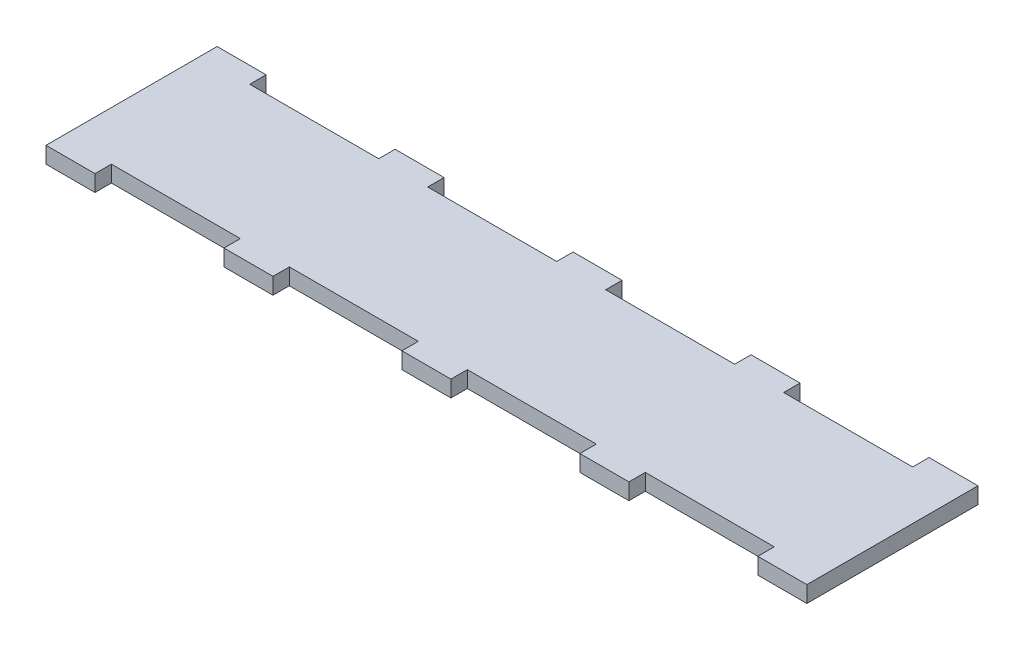
ISO-10303-21;
HEADER;
FILE_DESCRIPTION(('STEP AP214'),'2;1');
FILE_NAME('part.step','',(''),(''),'','','');
FILE_SCHEMA(('AUTOMOTIVE_DESIGN { 1 0 10303 214 1 1 1 1 }'));
ENDSEC;
DATA;
#1=APPLICATION_CONTEXT('core data for automotive mechanical design processes');
#2=APPLICATION_PROTOCOL_DEFINITION('international standard','automotive_design',2000,#1);
#3=PRODUCT_CONTEXT('',#1,'mechanical');
#4=PRODUCT('Part','Part','',(#3));
#5=PRODUCT_RELATED_PRODUCT_CATEGORY('part','',(#4));
#6=PRODUCT_DEFINITION_FORMATION('','',#4);
#7=PRODUCT_DEFINITION_CONTEXT('part definition',#1,'design');
#8=PRODUCT_DEFINITION('design','',#6,#7);
#9=PRODUCT_DEFINITION_SHAPE('','',#8);
#10=(LENGTH_UNIT() NAMED_UNIT(*) SI_UNIT(.MILLI.,.METRE.));
#11=(NAMED_UNIT(*) PLANE_ANGLE_UNIT() SI_UNIT($,.RADIAN.));
#12=(NAMED_UNIT(*) SI_UNIT($,.STERADIAN.) SOLID_ANGLE_UNIT());
#13=UNCERTAINTY_MEASURE_WITH_UNIT(LENGTH_MEASURE(1.E-05),#10,'distance_accuracy_value','');
#14=(GEOMETRIC_REPRESENTATION_CONTEXT(3) GLOBAL_UNCERTAINTY_ASSIGNED_CONTEXT((#13)) GLOBAL_UNIT_ASSIGNED_CONTEXT((#10,
#11,#12)) REPRESENTATION_CONTEXT('',''));
#15=CARTESIAN_POINT('',(0.,0.,0.));
#16=DIRECTION('',(0.,0.,1.));
#17=DIRECTION('',(1.,0.,0.));
#18=AXIS2_PLACEMENT_3D('',#15,#16,#17);
#19=CARTESIAN_POINT('',(0.,6.35,53.65));
#20=DIRECTION('',(1.,0.,0.));
#21=DIRECTION('',(0.,0.,-1.));
#22=AXIS2_PLACEMENT_3D('',#19,#20,#21);
#23=PLANE('',#22);
#24=DIRECTION('',(0.,0.,1.));
#25=VECTOR('',#24,1.);
#26=CARTESIAN_POINT('',(0.,0.,53.65));
#27=LINE('',#26,#25);
#28=CARTESIAN_POINT('',(0.,0.,-6.35));
#29=VERTEX_POINT('',#28);
#30=CARTESIAN_POINT('',(0.,0.,60.));
#31=VERTEX_POINT('',#30);
#32=EDGE_CURVE('E169',#29,#31,#27,.T.);
#33=ORIENTED_EDGE('',*,*,#32,.T.);
#34=DIRECTION('',(0.,-1.,0.));
#35=VECTOR('',#34,1.);
#36=CARTESIAN_POINT('',(0.,6.35,60.));
#37=LINE('',#36,#35);
#38=CARTESIAN_POINT('',(0.,6.35,60.));
#39=VERTEX_POINT('',#38);
#40=EDGE_CURVE('E11',#39,#31,#37,.T.);
#41=ORIENTED_EDGE('',*,*,#40,.F.);
#42=DIRECTION('',(0.,0.,1.));
#43=VECTOR('',#42,1.);
#44=CARTESIAN_POINT('',(0.,6.35,0.));
#45=LINE('',#44,#43);
#46=CARTESIAN_POINT('',(0.,6.35,-6.35));
#47=VERTEX_POINT('',#46);
#48=EDGE_CURVE('E175',#47,#39,#45,.T.);
#49=ORIENTED_EDGE('',*,*,#48,.F.);
#50=DIRECTION('',(0.,-1.,0.));
#51=VECTOR('',#50,1.);
#52=CARTESIAN_POINT('',(0.,6.35,-6.35));
#53=LINE('',#52,#51);
#54=EDGE_CURVE('E293',#47,#29,#53,.T.);
#55=ORIENTED_EDGE('',*,*,#54,.T.);
#56=EDGE_LOOP('',(#33,#41,#49,#55));
#57=FACE_BOUND('',#56,.T.);
#58=ADVANCED_FACE('F33',(#57),#23,.F.);
#59=CARTESIAN_POINT('',(0.,6.35,60.));
#60=DIRECTION('',(0.,0.,-1.));
#61=DIRECTION('',(-1.,0.,0.));
#62=AXIS2_PLACEMENT_3D('',#59,#60,#61);
#63=PLANE('',#62);
#64=DIRECTION('',(1.,0.,0.));
#65=VECTOR('',#64,1.);
#66=CARTESIAN_POINT('',(0.,0.,60.));
#67=LINE('',#66,#65);
#68=CARTESIAN_POINT('',(19.,0.,60.));
#69=VERTEX_POINT('',#68);
#70=EDGE_CURVE('E298',#31,#69,#67,.T.);
#71=ORIENTED_EDGE('',*,*,#70,.T.);
#72=DIRECTION('',(0.,-1.,0.));
#73=VECTOR('',#72,1.);
#74=CARTESIAN_POINT('',(19.,6.35,60.));
#75=LINE('',#74,#73);
#76=CARTESIAN_POINT('',(19.,6.35,60.));
#77=VERTEX_POINT('',#76);
#78=EDGE_CURVE('E41',#77,#69,#75,.T.);
#79=ORIENTED_EDGE('',*,*,#78,.F.);
#80=DIRECTION('',(1.,0.,0.));
#81=VECTOR('',#80,1.);
#82=CARTESIAN_POINT('',(0.,6.35,60.));
#83=LINE('',#82,#81);
#84=EDGE_CURVE('E555',#39,#77,#83,.T.);
#85=ORIENTED_EDGE('',*,*,#84,.F.);
#86=ORIENTED_EDGE('',*,*,#40,.T.);
#87=EDGE_LOOP('',(#71,#79,#85,#86));
#88=FACE_BOUND('',#87,.T.);
#89=ADVANCED_FACE('F558',(#88),#63,.F.);
#90=CARTESIAN_POINT('',(19.,6.35,53.65));
#91=DIRECTION('',(-1.,0.,0.));
#92=DIRECTION('',(0.,0.,1.));
#93=AXIS2_PLACEMENT_3D('',#90,#91,#92);
#94=PLANE('',#93);
#95=DIRECTION('',(0.,0.,-1.));
#96=VECTOR('',#95,1.);
#97=CARTESIAN_POINT('',(19.,0.,53.65));
#98=LINE('',#97,#96);
#99=CARTESIAN_POINT('',(19.,0.,53.65));
#100=VERTEX_POINT('',#99);
#101=EDGE_CURVE('E300',#69,#100,#98,.T.);
#102=ORIENTED_EDGE('',*,*,#101,.T.);
#103=DIRECTION('',(0.,-1.,0.));
#104=VECTOR('',#103,1.);
#105=CARTESIAN_POINT('',(19.,6.35,53.65));
#106=LINE('',#105,#104);
#107=CARTESIAN_POINT('',(19.,6.35,53.65));
#108=VERTEX_POINT('',#107);
#109=EDGE_CURVE('E458',#108,#100,#106,.T.);
#110=ORIENTED_EDGE('',*,*,#109,.F.);
#111=DIRECTION('',(0.,0.,-1.));
#112=VECTOR('',#111,1.);
#113=CARTESIAN_POINT('',(19.,6.35,53.65));
#114=LINE('',#113,#112);
#115=EDGE_CURVE('E467',#77,#108,#114,.T.);
#116=ORIENTED_EDGE('',*,*,#115,.F.);
#117=ORIENTED_EDGE('',*,*,#78,.T.);
#118=EDGE_LOOP('',(#102,#110,#116,#117));
#119=FACE_BOUND('',#118,.T.);
#120=ADVANCED_FACE('F465',(#119),#94,.F.);
#121=CARTESIAN_POINT('',(19.,6.35,53.65));
#122=DIRECTION('',(0.,0.,-1.));
#123=DIRECTION('',(-1.,0.,0.));
#124=AXIS2_PLACEMENT_3D('',#121,#122,#123);
#125=PLANE('',#124);
#126=DIRECTION('',(1.,0.,0.));
#127=VECTOR('',#126,1.);
#128=CARTESIAN_POINT('',(19.,0.,53.65));
#129=LINE('',#128,#127);
#130=CARTESIAN_POINT('',(69.,0.,53.65));
#131=VERTEX_POINT('',#130);
#132=EDGE_CURVE('E302',#100,#131,#129,.T.);
#133=ORIENTED_EDGE('',*,*,#132,.T.);
#134=DIRECTION('',(0.,-1.,0.));
#135=VECTOR('',#134,1.);
#136=CARTESIAN_POINT('',(69.,6.35,53.65));
#137=LINE('',#136,#135);
#138=CARTESIAN_POINT('',(69.,6.35,53.65));
#139=VERTEX_POINT('',#138);
#140=EDGE_CURVE('E455',#139,#131,#137,.T.);
#141=ORIENTED_EDGE('',*,*,#140,.F.);
#142=DIRECTION('',(1.,0.,0.));
#143=VECTOR('',#142,1.);
#144=CARTESIAN_POINT('',(19.,6.35,53.65));
#145=LINE('',#144,#143);
#146=EDGE_CURVE('E485',#108,#139,#145,.T.);
#147=ORIENTED_EDGE('',*,*,#146,.F.);
#148=ORIENTED_EDGE('',*,*,#109,.T.);
#149=EDGE_LOOP('',(#133,#141,#147,#148));
#150=FACE_BOUND('',#149,.T.);
#151=ADVANCED_FACE('F476',(#150),#125,.F.);
#152=CARTESIAN_POINT('',(69.,6.35,53.65));
#153=DIRECTION('',(1.,0.,0.));
#154=DIRECTION('',(0.,0.,-1.));
#155=AXIS2_PLACEMENT_3D('',#152,#153,#154);
#156=PLANE('',#155);
#157=DIRECTION('',(0.,0.,1.));
#158=VECTOR('',#157,1.);
#159=CARTESIAN_POINT('',(69.,0.,53.65));
#160=LINE('',#159,#158);
#161=CARTESIAN_POINT('',(69.,0.,60.));
#162=VERTEX_POINT('',#161);
#163=EDGE_CURVE('E304',#131,#162,#160,.T.);
#164=ORIENTED_EDGE('',*,*,#163,.T.);
#165=DIRECTION('',(0.,-1.,0.));
#166=VECTOR('',#165,1.);
#167=CARTESIAN_POINT('',(69.,6.35,60.));
#168=LINE('',#167,#166);
#169=CARTESIAN_POINT('',(69.,6.35,60.));
#170=VERTEX_POINT('',#169);
#171=EDGE_CURVE('E452',#170,#162,#168,.T.);
#172=ORIENTED_EDGE('',*,*,#171,.F.);
#173=DIRECTION('',(0.,0.,1.));
#174=VECTOR('',#173,1.);
#175=CARTESIAN_POINT('',(69.,6.35,53.65));
#176=LINE('',#175,#174);
#177=EDGE_CURVE('E482',#139,#170,#176,.T.);
#178=ORIENTED_EDGE('',*,*,#177,.F.);
#179=ORIENTED_EDGE('',*,*,#140,.T.);
#180=EDGE_LOOP('',(#164,#172,#178,#179));
#181=FACE_BOUND('',#180,.T.);
#182=ADVANCED_FACE('F480',(#181),#156,.F.);
#183=CARTESIAN_POINT('',(69.,6.35,60.));
#184=DIRECTION('',(0.,0.,-1.));
#185=DIRECTION('',(-1.,0.,0.));
#186=AXIS2_PLACEMENT_3D('',#183,#184,#185);
#187=PLANE('',#186);
#188=DIRECTION('',(1.,0.,0.));
#189=VECTOR('',#188,1.);
#190=CARTESIAN_POINT('',(69.,0.,60.));
#191=LINE('',#190,#189);
#192=CARTESIAN_POINT('',(88.,0.,60.));
#193=VERTEX_POINT('',#192);
#194=EDGE_CURVE('E306',#162,#193,#191,.T.);
#195=ORIENTED_EDGE('',*,*,#194,.T.);
#196=DIRECTION('',(0.,-1.,0.));
#197=VECTOR('',#196,1.);
#198=CARTESIAN_POINT('',(88.,6.35,60.));
#199=LINE('',#198,#197);
#200=CARTESIAN_POINT('',(88.,6.35,60.));
#201=VERTEX_POINT('',#200);
#202=EDGE_CURVE('E449',#201,#193,#199,.T.);
#203=ORIENTED_EDGE('',*,*,#202,.F.);
#204=DIRECTION('',(1.,0.,0.));
#205=VECTOR('',#204,1.);
#206=CARTESIAN_POINT('',(69.,6.35,60.));
#207=LINE('',#206,#205);
#208=EDGE_CURVE('E484',#170,#201,#207,.T.);
#209=ORIENTED_EDGE('',*,*,#208,.F.);
#210=ORIENTED_EDGE('',*,*,#171,.T.);
#211=EDGE_LOOP('',(#195,#203,#209,#210));
#212=FACE_BOUND('',#211,.T.);
#213=ADVANCED_FACE('F570',(#212),#187,.F.);
#214=CARTESIAN_POINT('',(88.,6.35,53.65));
#215=DIRECTION('',(-1.,0.,0.));
#216=DIRECTION('',(0.,0.,1.));
#217=AXIS2_PLACEMENT_3D('',#214,#215,#216);
#218=PLANE('',#217);
#219=DIRECTION('',(0.,0.,-1.));
#220=VECTOR('',#219,1.);
#221=CARTESIAN_POINT('',(88.,0.,53.65));
#222=LINE('',#221,#220);
#223=CARTESIAN_POINT('',(88.,0.,53.65));
#224=VERTEX_POINT('',#223);
#225=EDGE_CURVE('E308',#193,#224,#222,.T.);
#226=ORIENTED_EDGE('',*,*,#225,.T.);
#227=DIRECTION('',(0.,-1.,0.));
#228=VECTOR('',#227,1.);
#229=CARTESIAN_POINT('',(88.,6.35,53.65));
#230=LINE('',#229,#228);
#231=CARTESIAN_POINT('',(88.,6.35,53.65));
#232=VERTEX_POINT('',#231);
#233=EDGE_CURVE('E446',#232,#224,#230,.T.);
#234=ORIENTED_EDGE('',*,*,#233,.F.);
#235=DIRECTION('',(0.,0.,-1.));
#236=VECTOR('',#235,1.);
#237=CARTESIAN_POINT('',(88.,6.35,53.65));
#238=LINE('',#237,#236);
#239=EDGE_CURVE('E487',#201,#232,#238,.T.);
#240=ORIENTED_EDGE('',*,*,#239,.F.);
#241=ORIENTED_EDGE('',*,*,#202,.T.);
#242=EDGE_LOOP('',(#226,#234,#240,#241));
#243=FACE_BOUND('',#242,.T.);
#244=ADVANCED_FACE('F573',(#243),#218,.F.);
#245=CARTESIAN_POINT('',(88.,6.35,53.65));
#246=DIRECTION('',(0.,0.,-1.));
#247=DIRECTION('',(-1.,0.,0.));
#248=AXIS2_PLACEMENT_3D('',#245,#246,#247);
#249=PLANE('',#248);
#250=DIRECTION('',(1.,0.,0.));
#251=VECTOR('',#250,1.);
#252=CARTESIAN_POINT('',(88.,0.,53.65));
#253=LINE('',#252,#251);
#254=CARTESIAN_POINT('',(138.,0.,53.65));
#255=VERTEX_POINT('',#254);
#256=EDGE_CURVE('E310',#224,#255,#253,.T.);
#257=ORIENTED_EDGE('',*,*,#256,.T.);
#258=DIRECTION('',(0.,-1.,0.));
#259=VECTOR('',#258,1.);
#260=CARTESIAN_POINT('',(138.,6.35,53.65));
#261=LINE('',#260,#259);
#262=CARTESIAN_POINT('',(138.,6.35,53.65));
#263=VERTEX_POINT('',#262);
#264=EDGE_CURVE('E443',#263,#255,#261,.T.);
#265=ORIENTED_EDGE('',*,*,#264,.F.);
#266=DIRECTION('',(1.,0.,0.));
#267=VECTOR('',#266,1.);
#268=CARTESIAN_POINT('',(88.,6.35,53.65));
#269=LINE('',#268,#267);
#270=EDGE_CURVE('E493',#232,#263,#269,.T.);
#271=ORIENTED_EDGE('',*,*,#270,.F.);
#272=ORIENTED_EDGE('',*,*,#233,.T.);
#273=EDGE_LOOP('',(#257,#265,#271,#272));
#274=FACE_BOUND('',#273,.T.);
#275=ADVANCED_FACE('F577',(#274),#249,.F.);
#276=CARTESIAN_POINT('',(138.,6.35,53.65));
#277=DIRECTION('',(1.,0.,0.));
#278=DIRECTION('',(0.,0.,-1.));
#279=AXIS2_PLACEMENT_3D('',#276,#277,#278);
#280=PLANE('',#279);
#281=DIRECTION('',(0.,0.,1.));
#282=VECTOR('',#281,1.);
#283=CARTESIAN_POINT('',(138.,0.,53.65));
#284=LINE('',#283,#282);
#285=CARTESIAN_POINT('',(138.,0.,60.));
#286=VERTEX_POINT('',#285);
#287=EDGE_CURVE('E312',#255,#286,#284,.T.);
#288=ORIENTED_EDGE('',*,*,#287,.T.);
#289=DIRECTION('',(0.,-1.,0.));
#290=VECTOR('',#289,1.);
#291=CARTESIAN_POINT('',(138.,6.35,60.));
#292=LINE('',#291,#290);
#293=CARTESIAN_POINT('',(138.,6.35,60.));
#294=VERTEX_POINT('',#293);
#295=EDGE_CURVE('E440',#294,#286,#292,.T.);
#296=ORIENTED_EDGE('',*,*,#295,.F.);
#297=DIRECTION('',(0.,0.,1.));
#298=VECTOR('',#297,1.);
#299=CARTESIAN_POINT('',(138.,6.35,53.65));
#300=LINE('',#299,#298);
#301=EDGE_CURVE('E495',#263,#294,#300,.T.);
#302=ORIENTED_EDGE('',*,*,#301,.F.);
#303=ORIENTED_EDGE('',*,*,#264,.T.);
#304=EDGE_LOOP('',(#288,#296,#302,#303));
#305=FACE_BOUND('',#304,.T.);
#306=ADVANCED_FACE('F581',(#305),#280,.F.);
#307=CARTESIAN_POINT('',(138.,6.35,60.));
#308=DIRECTION('',(0.,0.,-1.));
#309=DIRECTION('',(-1.,0.,0.));
#310=AXIS2_PLACEMENT_3D('',#307,#308,#309);
#311=PLANE('',#310);
#312=DIRECTION('',(1.,0.,0.));
#313=VECTOR('',#312,1.);
#314=CARTESIAN_POINT('',(138.,0.,60.));
#315=LINE('',#314,#313);
#316=CARTESIAN_POINT('',(157.,0.,60.));
#317=VERTEX_POINT('',#316);
#318=EDGE_CURVE('E314',#286,#317,#315,.T.);
#319=ORIENTED_EDGE('',*,*,#318,.T.);
#320=DIRECTION('',(0.,-1.,0.));
#321=VECTOR('',#320,1.);
#322=CARTESIAN_POINT('',(157.,6.35,60.));
#323=LINE('',#322,#321);
#324=CARTESIAN_POINT('',(157.,6.35,60.));
#325=VERTEX_POINT('',#324);
#326=EDGE_CURVE('E437',#325,#317,#323,.T.);
#327=ORIENTED_EDGE('',*,*,#326,.F.);
#328=DIRECTION('',(1.,0.,0.));
#329=VECTOR('',#328,1.);
#330=CARTESIAN_POINT('',(138.,6.35,60.));
#331=LINE('',#330,#329);
#332=EDGE_CURVE('E497',#294,#325,#331,.T.);
#333=ORIENTED_EDGE('',*,*,#332,.F.);
#334=ORIENTED_EDGE('',*,*,#295,.T.);
#335=EDGE_LOOP('',(#319,#327,#333,#334));
#336=FACE_BOUND('',#335,.T.);
#337=ADVANCED_FACE('F585',(#336),#311,.F.);
#338=CARTESIAN_POINT('',(157.,6.35,53.65));
#339=DIRECTION('',(-1.,0.,0.));
#340=DIRECTION('',(0.,0.,1.));
#341=AXIS2_PLACEMENT_3D('',#338,#339,#340);
#342=PLANE('',#341);
#343=DIRECTION('',(0.,0.,-1.));
#344=VECTOR('',#343,1.);
#345=CARTESIAN_POINT('',(157.,0.,53.65));
#346=LINE('',#345,#344);
#347=CARTESIAN_POINT('',(157.,0.,53.65));
#348=VERTEX_POINT('',#347);
#349=EDGE_CURVE('E316',#317,#348,#346,.T.);
#350=ORIENTED_EDGE('',*,*,#349,.T.);
#351=DIRECTION('',(0.,-1.,0.));
#352=VECTOR('',#351,1.);
#353=CARTESIAN_POINT('',(157.,6.35,53.65));
#354=LINE('',#353,#352);
#355=CARTESIAN_POINT('',(157.,6.35,53.65));
#356=VERTEX_POINT('',#355);
#357=EDGE_CURVE('E434',#356,#348,#354,.T.);
#358=ORIENTED_EDGE('',*,*,#357,.F.);
#359=DIRECTION('',(0.,0.,-1.));
#360=VECTOR('',#359,1.);
#361=CARTESIAN_POINT('',(157.,6.35,53.65));
#362=LINE('',#361,#360);
#363=EDGE_CURVE('E499',#325,#356,#362,.T.);
#364=ORIENTED_EDGE('',*,*,#363,.F.);
#365=ORIENTED_EDGE('',*,*,#326,.T.);
#366=EDGE_LOOP('',(#350,#358,#364,#365));
#367=FACE_BOUND('',#366,.T.);
#368=ADVANCED_FACE('F589',(#367),#342,.F.);
#369=CARTESIAN_POINT('',(157.,6.35,53.65));
#370=DIRECTION('',(0.,0.,-1.));
#371=DIRECTION('',(-1.,0.,0.));
#372=AXIS2_PLACEMENT_3D('',#369,#370,#371);
#373=PLANE('',#372);
#374=DIRECTION('',(1.,0.,0.));
#375=VECTOR('',#374,1.);
#376=CARTESIAN_POINT('',(157.,0.,53.65));
#377=LINE('',#376,#375);
#378=CARTESIAN_POINT('',(207.,0.,53.65));
#379=VERTEX_POINT('',#378);
#380=EDGE_CURVE('E318',#348,#379,#377,.T.);
#381=ORIENTED_EDGE('',*,*,#380,.T.);
#382=DIRECTION('',(0.,-1.,0.));
#383=VECTOR('',#382,1.);
#384=CARTESIAN_POINT('',(207.,6.35,53.65));
#385=LINE('',#384,#383);
#386=CARTESIAN_POINT('',(207.,6.35,53.65));
#387=VERTEX_POINT('',#386);
#388=EDGE_CURVE('E431',#387,#379,#385,.T.);
#389=ORIENTED_EDGE('',*,*,#388,.F.);
#390=DIRECTION('',(1.,0.,0.));
#391=VECTOR('',#390,1.);
#392=CARTESIAN_POINT('',(157.,6.35,53.65));
#393=LINE('',#392,#391);
#394=EDGE_CURVE('E501',#356,#387,#393,.T.);
#395=ORIENTED_EDGE('',*,*,#394,.F.);
#396=ORIENTED_EDGE('',*,*,#357,.T.);
#397=EDGE_LOOP('',(#381,#389,#395,#396));
#398=FACE_BOUND('',#397,.T.);
#399=ADVANCED_FACE('F593',(#398),#373,.F.);
#400=CARTESIAN_POINT('',(207.,6.35,53.65));
#401=DIRECTION('',(1.,0.,0.));
#402=DIRECTION('',(0.,0.,-1.));
#403=AXIS2_PLACEMENT_3D('',#400,#401,#402);
#404=PLANE('',#403);
#405=DIRECTION('',(0.,0.,1.));
#406=VECTOR('',#405,1.);
#407=CARTESIAN_POINT('',(207.,0.,53.65));
#408=LINE('',#407,#406);
#409=CARTESIAN_POINT('',(207.,0.,60.));
#410=VERTEX_POINT('',#409);
#411=EDGE_CURVE('E320',#379,#410,#408,.T.);
#412=ORIENTED_EDGE('',*,*,#411,.T.);
#413=DIRECTION('',(0.,-1.,0.));
#414=VECTOR('',#413,1.);
#415=CARTESIAN_POINT('',(207.,6.35,60.));
#416=LINE('',#415,#414);
#417=CARTESIAN_POINT('',(207.,6.35,60.));
#418=VERTEX_POINT('',#417);
#419=EDGE_CURVE('E428',#418,#410,#416,.T.);
#420=ORIENTED_EDGE('',*,*,#419,.F.);
#421=DIRECTION('',(0.,0.,1.));
#422=VECTOR('',#421,1.);
#423=CARTESIAN_POINT('',(207.,6.35,53.65));
#424=LINE('',#423,#422);
#425=EDGE_CURVE('E503',#387,#418,#424,.T.);
#426=ORIENTED_EDGE('',*,*,#425,.F.);
#427=ORIENTED_EDGE('',*,*,#388,.T.);
#428=EDGE_LOOP('',(#412,#420,#426,#427));
#429=FACE_BOUND('',#428,.T.);
#430=ADVANCED_FACE('F597',(#429),#404,.F.);
#431=CARTESIAN_POINT('',(207.,6.35,60.));
#432=DIRECTION('',(0.,0.,-1.));
#433=DIRECTION('',(-1.,0.,0.));
#434=AXIS2_PLACEMENT_3D('',#431,#432,#433);
#435=PLANE('',#434);
#436=DIRECTION('',(1.,0.,0.));
#437=VECTOR('',#436,1.);
#438=CARTESIAN_POINT('',(207.,0.,60.));
#439=LINE('',#438,#437);
#440=CARTESIAN_POINT('',(226.,0.,60.));
#441=VERTEX_POINT('',#440);
#442=EDGE_CURVE('E322',#410,#441,#439,.T.);
#443=ORIENTED_EDGE('',*,*,#442,.T.);
#444=DIRECTION('',(0.,-1.,0.));
#445=VECTOR('',#444,1.);
#446=CARTESIAN_POINT('',(226.,6.35,60.));
#447=LINE('',#446,#445);
#448=CARTESIAN_POINT('',(226.,6.35,60.));
#449=VERTEX_POINT('',#448);
#450=EDGE_CURVE('E425',#449,#441,#447,.T.);
#451=ORIENTED_EDGE('',*,*,#450,.F.);
#452=DIRECTION('',(1.,0.,0.));
#453=VECTOR('',#452,1.);
#454=CARTESIAN_POINT('',(207.,6.35,60.));
#455=LINE('',#454,#453);
#456=EDGE_CURVE('E505',#418,#449,#455,.T.);
#457=ORIENTED_EDGE('',*,*,#456,.F.);
#458=ORIENTED_EDGE('',*,*,#419,.T.);
#459=EDGE_LOOP('',(#443,#451,#457,#458));
#460=FACE_BOUND('',#459,.T.);
#461=ADVANCED_FACE('F601',(#460),#435,.F.);
#462=CARTESIAN_POINT('',(226.,6.35,53.65));
#463=DIRECTION('',(-1.,0.,0.));
#464=DIRECTION('',(0.,0.,1.));
#465=AXIS2_PLACEMENT_3D('',#462,#463,#464);
#466=PLANE('',#465);
#467=DIRECTION('',(0.,0.,-1.));
#468=VECTOR('',#467,1.);
#469=CARTESIAN_POINT('',(226.,0.,53.65));
#470=LINE('',#469,#468);
#471=CARTESIAN_POINT('',(226.,0.,53.65));
#472=VERTEX_POINT('',#471);
#473=EDGE_CURVE('E324',#441,#472,#470,.T.);
#474=ORIENTED_EDGE('',*,*,#473,.T.);
#475=DIRECTION('',(0.,-1.,0.));
#476=VECTOR('',#475,1.);
#477=CARTESIAN_POINT('',(226.,6.35,53.65));
#478=LINE('',#477,#476);
#479=CARTESIAN_POINT('',(226.,6.35,53.65));
#480=VERTEX_POINT('',#479);
#481=EDGE_CURVE('E422',#480,#472,#478,.T.);
#482=ORIENTED_EDGE('',*,*,#481,.F.);
#483=DIRECTION('',(0.,0.,-1.));
#484=VECTOR('',#483,1.);
#485=CARTESIAN_POINT('',(226.,6.35,53.65));
#486=LINE('',#485,#484);
#487=EDGE_CURVE('E507',#449,#480,#486,.T.);
#488=ORIENTED_EDGE('',*,*,#487,.F.);
#489=ORIENTED_EDGE('',*,*,#450,.T.);
#490=EDGE_LOOP('',(#474,#482,#488,#489));
#491=FACE_BOUND('',#490,.T.);
#492=ADVANCED_FACE('F605',(#491),#466,.F.);
#493=CARTESIAN_POINT('',(226.,6.35,53.65));
#494=DIRECTION('',(0.,0.,-1.));
#495=DIRECTION('',(-1.,0.,0.));
#496=AXIS2_PLACEMENT_3D('',#493,#494,#495);
#497=PLANE('',#496);
#498=DIRECTION('',(1.,0.,0.));
#499=VECTOR('',#498,1.);
#500=CARTESIAN_POINT('',(226.,0.,53.65));
#501=LINE('',#500,#499);
#502=CARTESIAN_POINT('',(276.,0.,53.65));
#503=VERTEX_POINT('',#502);
#504=EDGE_CURVE('E326',#472,#503,#501,.T.);
#505=ORIENTED_EDGE('',*,*,#504,.T.);
#506=DIRECTION('',(0.,-1.,0.));
#507=VECTOR('',#506,1.);
#508=CARTESIAN_POINT('',(276.,6.35,53.65));
#509=LINE('',#508,#507);
#510=CARTESIAN_POINT('',(276.,6.35,53.65));
#511=VERTEX_POINT('',#510);
#512=EDGE_CURVE('E419',#511,#503,#509,.T.);
#513=ORIENTED_EDGE('',*,*,#512,.F.);
#514=DIRECTION('',(1.,0.,0.));
#515=VECTOR('',#514,1.);
#516=CARTESIAN_POINT('',(226.,6.35,53.65));
#517=LINE('',#516,#515);
#518=EDGE_CURVE('E509',#480,#511,#517,.T.);
#519=ORIENTED_EDGE('',*,*,#518,.F.);
#520=ORIENTED_EDGE('',*,*,#481,.T.);
#521=EDGE_LOOP('',(#505,#513,#519,#520));
#522=FACE_BOUND('',#521,.T.);
#523=ADVANCED_FACE('F609',(#522),#497,.F.);
#524=CARTESIAN_POINT('',(276.,6.35,53.65));
#525=DIRECTION('',(1.,0.,0.));
#526=DIRECTION('',(0.,0.,-1.));
#527=AXIS2_PLACEMENT_3D('',#524,#525,#526);
#528=PLANE('',#527);
#529=DIRECTION('',(0.,0.,1.));
#530=VECTOR('',#529,1.);
#531=CARTESIAN_POINT('',(276.,0.,53.65));
#532=LINE('',#531,#530);
#533=CARTESIAN_POINT('',(276.,0.,60.));
#534=VERTEX_POINT('',#533);
#535=EDGE_CURVE('E328',#503,#534,#532,.T.);
#536=ORIENTED_EDGE('',*,*,#535,.T.);
#537=DIRECTION('',(0.,-1.,0.));
#538=VECTOR('',#537,1.);
#539=CARTESIAN_POINT('',(276.,6.35,60.));
#540=LINE('',#539,#538);
#541=CARTESIAN_POINT('',(276.,6.35,60.));
#542=VERTEX_POINT('',#541);
#543=EDGE_CURVE('E416',#542,#534,#540,.T.);
#544=ORIENTED_EDGE('',*,*,#543,.F.);
#545=DIRECTION('',(0.,0.,1.));
#546=VECTOR('',#545,1.);
#547=CARTESIAN_POINT('',(276.,6.35,53.65));
#548=LINE('',#547,#546);
#549=EDGE_CURVE('E511',#511,#542,#548,.T.);
#550=ORIENTED_EDGE('',*,*,#549,.F.);
#551=ORIENTED_EDGE('',*,*,#512,.T.);
#552=EDGE_LOOP('',(#536,#544,#550,#551));
#553=FACE_BOUND('',#552,.T.);
#554=ADVANCED_FACE('F613',(#553),#528,.F.);
#555=CARTESIAN_POINT('',(276.,6.35,60.));
#556=DIRECTION('',(0.,0.,-1.));
#557=DIRECTION('',(-1.,0.,0.));
#558=AXIS2_PLACEMENT_3D('',#555,#556,#557);
#559=PLANE('',#558);
#560=DIRECTION('',(1.,0.,0.));
#561=VECTOR('',#560,1.);
#562=CARTESIAN_POINT('',(276.,0.,60.));
#563=LINE('',#562,#561);
#564=CARTESIAN_POINT('',(295.,0.,60.));
#565=VERTEX_POINT('',#564);
#566=EDGE_CURVE('E330',#534,#565,#563,.T.);
#567=ORIENTED_EDGE('',*,*,#566,.T.);
#568=DIRECTION('',(0.,-1.,0.));
#569=VECTOR('',#568,1.);
#570=CARTESIAN_POINT('',(295.,6.35,60.));
#571=LINE('',#570,#569);
#572=CARTESIAN_POINT('',(295.,6.35,60.));
#573=VERTEX_POINT('',#572);
#574=EDGE_CURVE('E413',#573,#565,#571,.T.);
#575=ORIENTED_EDGE('',*,*,#574,.F.);
#576=DIRECTION('',(1.,0.,0.));
#577=VECTOR('',#576,1.);
#578=CARTESIAN_POINT('',(276.,6.35,60.));
#579=LINE('',#578,#577);
#580=EDGE_CURVE('E513',#542,#573,#579,.T.);
#581=ORIENTED_EDGE('',*,*,#580,.F.);
#582=ORIENTED_EDGE('',*,*,#543,.T.);
#583=EDGE_LOOP('',(#567,#575,#581,#582));
#584=FACE_BOUND('',#583,.T.);
#585=ADVANCED_FACE('F617',(#584),#559,.F.);
#586=CARTESIAN_POINT('',(295.,6.35,0.));
#587=DIRECTION('',(-1.,0.,0.));
#588=DIRECTION('',(0.,0.,1.));
#589=AXIS2_PLACEMENT_3D('',#586,#587,#588);
#590=PLANE('',#589);
#591=DIRECTION('',(0.,0.,-1.));
#592=VECTOR('',#591,1.);
#593=CARTESIAN_POINT('',(295.,0.,0.));
#594=LINE('',#593,#592);
#595=CARTESIAN_POINT('',(295.,0.,-6.35));
#596=VERTEX_POINT('',#595);
#597=EDGE_CURVE('E333',#565,#596,#594,.T.);
#598=ORIENTED_EDGE('',*,*,#597,.T.);
#599=DIRECTION('',(0.,-1.,0.));
#600=VECTOR('',#599,1.);
#601=CARTESIAN_POINT('',(295.,6.35,-6.35));
#602=LINE('',#601,#600);
#603=CARTESIAN_POINT('',(295.,6.35,-6.35));
#604=VERTEX_POINT('',#603);
#605=EDGE_CURVE('E410',#604,#596,#602,.T.);
#606=ORIENTED_EDGE('',*,*,#605,.F.);
#607=DIRECTION('',(0.,0.,-1.));
#608=VECTOR('',#607,1.);
#609=CARTESIAN_POINT('',(295.,6.35,53.65));
#610=LINE('',#609,#608);
#611=EDGE_CURVE('E515',#573,#604,#610,.T.);
#612=ORIENTED_EDGE('',*,*,#611,.F.);
#613=ORIENTED_EDGE('',*,*,#574,.T.);
#614=EDGE_LOOP('',(#598,#606,#612,#613));
#615=FACE_BOUND('',#614,.T.);
#616=ADVANCED_FACE('F621',(#615),#590,.F.);
#617=CARTESIAN_POINT('',(276.,6.35,-6.35));
#618=DIRECTION('',(0.,0.,1.));
#619=DIRECTION('',(1.,0.,0.));
#620=AXIS2_PLACEMENT_3D('',#617,#618,#619);
#621=PLANE('',#620);
#622=DIRECTION('',(-1.,0.,0.));
#623=VECTOR('',#622,1.);
#624=CARTESIAN_POINT('',(276.,0.,-6.35));
#625=LINE('',#624,#623);
#626=CARTESIAN_POINT('',(276.,0.,-6.35));
#627=VERTEX_POINT('',#626);
#628=EDGE_CURVE('E335',#596,#627,#625,.T.);
#629=ORIENTED_EDGE('',*,*,#628,.T.);
#630=DIRECTION('',(0.,-1.,0.));
#631=VECTOR('',#630,1.);
#632=CARTESIAN_POINT('',(276.,6.35,-6.35));
#633=LINE('',#632,#631);
#634=CARTESIAN_POINT('',(276.,6.35,-6.35));
#635=VERTEX_POINT('',#634);
#636=EDGE_CURVE('E407',#635,#627,#633,.T.);
#637=ORIENTED_EDGE('',*,*,#636,.F.);
#638=DIRECTION('',(-1.,0.,0.));
#639=VECTOR('',#638,1.);
#640=CARTESIAN_POINT('',(276.,6.35,-6.35));
#641=LINE('',#640,#639);
#642=EDGE_CURVE('E517',#604,#635,#641,.T.);
#643=ORIENTED_EDGE('',*,*,#642,.F.);
#644=ORIENTED_EDGE('',*,*,#605,.T.);
#645=EDGE_LOOP('',(#629,#637,#643,#644));
#646=FACE_BOUND('',#645,.T.);
#647=ADVANCED_FACE('F625',(#646),#621,.F.);
#648=CARTESIAN_POINT('',(276.,6.35,0.));
#649=DIRECTION('',(1.,0.,0.));
#650=DIRECTION('',(0.,0.,-1.));
#651=AXIS2_PLACEMENT_3D('',#648,#649,#650);
#652=PLANE('',#651);
#653=DIRECTION('',(0.,0.,1.));
#654=VECTOR('',#653,1.);
#655=CARTESIAN_POINT('',(276.,0.,0.));
#656=LINE('',#655,#654);
#657=CARTESIAN_POINT('',(276.,0.,0.));
#658=VERTEX_POINT('',#657);
#659=EDGE_CURVE('E337',#627,#658,#656,.T.);
#660=ORIENTED_EDGE('',*,*,#659,.T.);
#661=DIRECTION('',(0.,-1.,0.));
#662=VECTOR('',#661,1.);
#663=CARTESIAN_POINT('',(276.,6.35,0.));
#664=LINE('',#663,#662);
#665=CARTESIAN_POINT('',(276.,6.35,0.));
#666=VERTEX_POINT('',#665);
#667=EDGE_CURVE('E404',#666,#658,#664,.T.);
#668=ORIENTED_EDGE('',*,*,#667,.F.);
#669=DIRECTION('',(0.,0.,1.));
#670=VECTOR('',#669,1.);
#671=CARTESIAN_POINT('',(276.,6.35,0.));
#672=LINE('',#671,#670);
#673=EDGE_CURVE('E519',#635,#666,#672,.T.);
#674=ORIENTED_EDGE('',*,*,#673,.F.);
#675=ORIENTED_EDGE('',*,*,#636,.T.);
#676=EDGE_LOOP('',(#660,#668,#674,#675));
#677=FACE_BOUND('',#676,.T.);
#678=ADVANCED_FACE('F629',(#677),#652,.F.);
#679=CARTESIAN_POINT('',(226.,6.35,0.));
#680=DIRECTION('',(0.,0.,1.));
#681=DIRECTION('',(1.,0.,0.));
#682=AXIS2_PLACEMENT_3D('',#679,#680,#681);
#683=PLANE('',#682);
#684=DIRECTION('',(-1.,0.,0.));
#685=VECTOR('',#684,1.);
#686=CARTESIAN_POINT('',(226.,0.,0.));
#687=LINE('',#686,#685);
#688=CARTESIAN_POINT('',(226.,0.,0.));
#689=VERTEX_POINT('',#688);
#690=EDGE_CURVE('E339',#658,#689,#687,.T.);
#691=ORIENTED_EDGE('',*,*,#690,.T.);
#692=DIRECTION('',(0.,-1.,0.));
#693=VECTOR('',#692,1.);
#694=CARTESIAN_POINT('',(226.,6.35,0.));
#695=LINE('',#694,#693);
#696=CARTESIAN_POINT('',(226.,6.35,0.));
#697=VERTEX_POINT('',#696);
#698=EDGE_CURVE('E401',#697,#689,#695,.T.);
#699=ORIENTED_EDGE('',*,*,#698,.F.);
#700=DIRECTION('',(-1.,0.,0.));
#701=VECTOR('',#700,1.);
#702=CARTESIAN_POINT('',(226.,6.35,0.));
#703=LINE('',#702,#701);
#704=EDGE_CURVE('E521',#666,#697,#703,.T.);
#705=ORIENTED_EDGE('',*,*,#704,.F.);
#706=ORIENTED_EDGE('',*,*,#667,.T.);
#707=EDGE_LOOP('',(#691,#699,#705,#706));
#708=FACE_BOUND('',#707,.T.);
#709=ADVANCED_FACE('F633',(#708),#683,.F.);
#710=CARTESIAN_POINT('',(226.,6.35,0.));
#711=DIRECTION('',(-1.,0.,0.));
#712=DIRECTION('',(0.,0.,1.));
#713=AXIS2_PLACEMENT_3D('',#710,#711,#712);
#714=PLANE('',#713);
#715=DIRECTION('',(0.,0.,-1.));
#716=VECTOR('',#715,1.);
#717=CARTESIAN_POINT('',(226.,0.,0.));
#718=LINE('',#717,#716);
#719=CARTESIAN_POINT('',(226.,0.,-6.35));
#720=VERTEX_POINT('',#719);
#721=EDGE_CURVE('E341',#689,#720,#718,.T.);
#722=ORIENTED_EDGE('',*,*,#721,.T.);
#723=DIRECTION('',(0.,-1.,0.));
#724=VECTOR('',#723,1.);
#725=CARTESIAN_POINT('',(226.,6.35,-6.35));
#726=LINE('',#725,#724);
#727=CARTESIAN_POINT('',(226.,6.35,-6.35));
#728=VERTEX_POINT('',#727);
#729=EDGE_CURVE('E398',#728,#720,#726,.T.);
#730=ORIENTED_EDGE('',*,*,#729,.F.);
#731=DIRECTION('',(0.,0.,-1.));
#732=VECTOR('',#731,1.);
#733=CARTESIAN_POINT('',(226.,6.35,0.));
#734=LINE('',#733,#732);
#735=EDGE_CURVE('E523',#697,#728,#734,.T.);
#736=ORIENTED_EDGE('',*,*,#735,.F.);
#737=ORIENTED_EDGE('',*,*,#698,.T.);
#738=EDGE_LOOP('',(#722,#730,#736,#737));
#739=FACE_BOUND('',#738,.T.);
#740=ADVANCED_FACE('F637',(#739),#714,.F.);
#741=CARTESIAN_POINT('',(207.,6.35,-6.35));
#742=DIRECTION('',(0.,0.,1.));
#743=DIRECTION('',(1.,0.,0.));
#744=AXIS2_PLACEMENT_3D('',#741,#742,#743);
#745=PLANE('',#744);
#746=DIRECTION('',(-1.,0.,0.));
#747=VECTOR('',#746,1.);
#748=CARTESIAN_POINT('',(207.,0.,-6.35));
#749=LINE('',#748,#747);
#750=CARTESIAN_POINT('',(207.,0.,-6.35));
#751=VERTEX_POINT('',#750);
#752=EDGE_CURVE('E343',#720,#751,#749,.T.);
#753=ORIENTED_EDGE('',*,*,#752,.T.);
#754=DIRECTION('',(0.,-1.,0.));
#755=VECTOR('',#754,1.);
#756=CARTESIAN_POINT('',(207.,6.35,-6.35));
#757=LINE('',#756,#755);
#758=CARTESIAN_POINT('',(207.,6.35,-6.35));
#759=VERTEX_POINT('',#758);
#760=EDGE_CURVE('E395',#759,#751,#757,.T.);
#761=ORIENTED_EDGE('',*,*,#760,.F.);
#762=DIRECTION('',(-1.,0.,0.));
#763=VECTOR('',#762,1.);
#764=CARTESIAN_POINT('',(207.,6.35,-6.35));
#765=LINE('',#764,#763);
#766=EDGE_CURVE('E525',#728,#759,#765,.T.);
#767=ORIENTED_EDGE('',*,*,#766,.F.);
#768=ORIENTED_EDGE('',*,*,#729,.T.);
#769=EDGE_LOOP('',(#753,#761,#767,#768));
#770=FACE_BOUND('',#769,.T.);
#771=ADVANCED_FACE('F641',(#770),#745,.F.);
#772=CARTESIAN_POINT('',(207.,6.35,0.));
#773=DIRECTION('',(1.,0.,0.));
#774=DIRECTION('',(0.,0.,-1.));
#775=AXIS2_PLACEMENT_3D('',#772,#773,#774);
#776=PLANE('',#775);
#777=DIRECTION('',(0.,0.,1.));
#778=VECTOR('',#777,1.);
#779=CARTESIAN_POINT('',(207.,0.,0.));
#780=LINE('',#779,#778);
#781=CARTESIAN_POINT('',(207.,0.,0.));
#782=VERTEX_POINT('',#781);
#783=EDGE_CURVE('E345',#751,#782,#780,.T.);
#784=ORIENTED_EDGE('',*,*,#783,.T.);
#785=DIRECTION('',(0.,-1.,0.));
#786=VECTOR('',#785,1.);
#787=CARTESIAN_POINT('',(207.,6.35,0.));
#788=LINE('',#787,#786);
#789=CARTESIAN_POINT('',(207.,6.35,0.));
#790=VERTEX_POINT('',#789);
#791=EDGE_CURVE('E392',#790,#782,#788,.T.);
#792=ORIENTED_EDGE('',*,*,#791,.F.);
#793=DIRECTION('',(0.,0.,1.));
#794=VECTOR('',#793,1.);
#795=CARTESIAN_POINT('',(207.,6.35,0.));
#796=LINE('',#795,#794);
#797=EDGE_CURVE('E527',#759,#790,#796,.T.);
#798=ORIENTED_EDGE('',*,*,#797,.F.);
#799=ORIENTED_EDGE('',*,*,#760,.T.);
#800=EDGE_LOOP('',(#784,#792,#798,#799));
#801=FACE_BOUND('',#800,.T.);
#802=ADVANCED_FACE('F645',(#801),#776,.F.);
#803=CARTESIAN_POINT('',(157.,6.35,0.));
#804=DIRECTION('',(0.,0.,1.));
#805=DIRECTION('',(1.,0.,0.));
#806=AXIS2_PLACEMENT_3D('',#803,#804,#805);
#807=PLANE('',#806);
#808=DIRECTION('',(-1.,0.,0.));
#809=VECTOR('',#808,1.);
#810=CARTESIAN_POINT('',(157.,0.,0.));
#811=LINE('',#810,#809);
#812=CARTESIAN_POINT('',(157.,0.,0.));
#813=VERTEX_POINT('',#812);
#814=EDGE_CURVE('E347',#782,#813,#811,.T.);
#815=ORIENTED_EDGE('',*,*,#814,.T.);
#816=DIRECTION('',(0.,-1.,0.));
#817=VECTOR('',#816,1.);
#818=CARTESIAN_POINT('',(157.,6.35,0.));
#819=LINE('',#818,#817);
#820=CARTESIAN_POINT('',(157.,6.35,0.));
#821=VERTEX_POINT('',#820);
#822=EDGE_CURVE('E389',#821,#813,#819,.T.);
#823=ORIENTED_EDGE('',*,*,#822,.F.);
#824=DIRECTION('',(-1.,0.,0.));
#825=VECTOR('',#824,1.);
#826=CARTESIAN_POINT('',(157.,6.35,0.));
#827=LINE('',#826,#825);
#828=EDGE_CURVE('E529',#790,#821,#827,.T.);
#829=ORIENTED_EDGE('',*,*,#828,.F.);
#830=ORIENTED_EDGE('',*,*,#791,.T.);
#831=EDGE_LOOP('',(#815,#823,#829,#830));
#832=FACE_BOUND('',#831,.T.);
#833=ADVANCED_FACE('F649',(#832),#807,.F.);
#834=CARTESIAN_POINT('',(157.,6.35,0.));
#835=DIRECTION('',(-1.,0.,0.));
#836=DIRECTION('',(0.,0.,1.));
#837=AXIS2_PLACEMENT_3D('',#834,#835,#836);
#838=PLANE('',#837);
#839=DIRECTION('',(0.,0.,-1.));
#840=VECTOR('',#839,1.);
#841=CARTESIAN_POINT('',(157.,0.,0.));
#842=LINE('',#841,#840);
#843=CARTESIAN_POINT('',(157.,0.,-6.35));
#844=VERTEX_POINT('',#843);
#845=EDGE_CURVE('E349',#813,#844,#842,.T.);
#846=ORIENTED_EDGE('',*,*,#845,.T.);
#847=DIRECTION('',(0.,-1.,0.));
#848=VECTOR('',#847,1.);
#849=CARTESIAN_POINT('',(157.,6.35,-6.35));
#850=LINE('',#849,#848);
#851=CARTESIAN_POINT('',(157.,6.35,-6.35));
#852=VERTEX_POINT('',#851);
#853=EDGE_CURVE('E386',#852,#844,#850,.T.);
#854=ORIENTED_EDGE('',*,*,#853,.F.);
#855=DIRECTION('',(0.,0.,-1.));
#856=VECTOR('',#855,1.);
#857=CARTESIAN_POINT('',(157.,6.35,0.));
#858=LINE('',#857,#856);
#859=EDGE_CURVE('E531',#821,#852,#858,.T.);
#860=ORIENTED_EDGE('',*,*,#859,.F.);
#861=ORIENTED_EDGE('',*,*,#822,.T.);
#862=EDGE_LOOP('',(#846,#854,#860,#861));
#863=FACE_BOUND('',#862,.T.);
#864=ADVANCED_FACE('F653',(#863),#838,.F.);
#865=CARTESIAN_POINT('',(138.,6.35,-6.35));
#866=DIRECTION('',(0.,0.,1.));
#867=DIRECTION('',(1.,0.,0.));
#868=AXIS2_PLACEMENT_3D('',#865,#866,#867);
#869=PLANE('',#868);
#870=DIRECTION('',(-1.,0.,0.));
#871=VECTOR('',#870,1.);
#872=CARTESIAN_POINT('',(138.,0.,-6.35));
#873=LINE('',#872,#871);
#874=CARTESIAN_POINT('',(138.,0.,-6.35));
#875=VERTEX_POINT('',#874);
#876=EDGE_CURVE('E351',#844,#875,#873,.T.);
#877=ORIENTED_EDGE('',*,*,#876,.T.);
#878=DIRECTION('',(0.,-1.,0.));
#879=VECTOR('',#878,1.);
#880=CARTESIAN_POINT('',(138.,6.35,-6.35));
#881=LINE('',#880,#879);
#882=CARTESIAN_POINT('',(138.,6.35,-6.35));
#883=VERTEX_POINT('',#882);
#884=EDGE_CURVE('E383',#883,#875,#881,.T.);
#885=ORIENTED_EDGE('',*,*,#884,.F.);
#886=DIRECTION('',(-1.,0.,0.));
#887=VECTOR('',#886,1.);
#888=CARTESIAN_POINT('',(138.,6.35,-6.35));
#889=LINE('',#888,#887);
#890=EDGE_CURVE('E533',#852,#883,#889,.T.);
#891=ORIENTED_EDGE('',*,*,#890,.F.);
#892=ORIENTED_EDGE('',*,*,#853,.T.);
#893=EDGE_LOOP('',(#877,#885,#891,#892));
#894=FACE_BOUND('',#893,.T.);
#895=ADVANCED_FACE('F657',(#894),#869,.F.);
#896=CARTESIAN_POINT('',(138.,6.35,0.));
#897=DIRECTION('',(1.,0.,0.));
#898=DIRECTION('',(0.,0.,-1.));
#899=AXIS2_PLACEMENT_3D('',#896,#897,#898);
#900=PLANE('',#899);
#901=DIRECTION('',(0.,0.,1.));
#902=VECTOR('',#901,1.);
#903=CARTESIAN_POINT('',(138.,0.,0.));
#904=LINE('',#903,#902);
#905=CARTESIAN_POINT('',(138.,0.,0.));
#906=VERTEX_POINT('',#905);
#907=EDGE_CURVE('E353',#875,#906,#904,.T.);
#908=ORIENTED_EDGE('',*,*,#907,.T.);
#909=DIRECTION('',(0.,-1.,0.));
#910=VECTOR('',#909,1.);
#911=CARTESIAN_POINT('',(138.,6.35,0.));
#912=LINE('',#911,#910);
#913=CARTESIAN_POINT('',(138.,6.35,0.));
#914=VERTEX_POINT('',#913);
#915=EDGE_CURVE('E380',#914,#906,#912,.T.);
#916=ORIENTED_EDGE('',*,*,#915,.F.);
#917=DIRECTION('',(0.,0.,1.));
#918=VECTOR('',#917,1.);
#919=CARTESIAN_POINT('',(138.,6.35,0.));
#920=LINE('',#919,#918);
#921=EDGE_CURVE('E535',#883,#914,#920,.T.);
#922=ORIENTED_EDGE('',*,*,#921,.F.);
#923=ORIENTED_EDGE('',*,*,#884,.T.);
#924=EDGE_LOOP('',(#908,#916,#922,#923));
#925=FACE_BOUND('',#924,.T.);
#926=ADVANCED_FACE('F661',(#925),#900,.F.);
#927=CARTESIAN_POINT('',(88.,6.35,0.));
#928=DIRECTION('',(0.,0.,1.));
#929=DIRECTION('',(1.,0.,0.));
#930=AXIS2_PLACEMENT_3D('',#927,#928,#929);
#931=PLANE('',#930);
#932=DIRECTION('',(-1.,0.,0.));
#933=VECTOR('',#932,1.);
#934=CARTESIAN_POINT('',(88.,0.,0.));
#935=LINE('',#934,#933);
#936=CARTESIAN_POINT('',(88.,0.,0.));
#937=VERTEX_POINT('',#936);
#938=EDGE_CURVE('E355',#906,#937,#935,.T.);
#939=ORIENTED_EDGE('',*,*,#938,.T.);
#940=DIRECTION('',(0.,-1.,0.));
#941=VECTOR('',#940,1.);
#942=CARTESIAN_POINT('',(88.,6.35,0.));
#943=LINE('',#942,#941);
#944=CARTESIAN_POINT('',(88.,6.35,0.));
#945=VERTEX_POINT('',#944);
#946=EDGE_CURVE('E377',#945,#937,#943,.T.);
#947=ORIENTED_EDGE('',*,*,#946,.F.);
#948=DIRECTION('',(-1.,0.,0.));
#949=VECTOR('',#948,1.);
#950=CARTESIAN_POINT('',(88.,6.35,0.));
#951=LINE('',#950,#949);
#952=EDGE_CURVE('E537',#914,#945,#951,.T.);
#953=ORIENTED_EDGE('',*,*,#952,.F.);
#954=ORIENTED_EDGE('',*,*,#915,.T.);
#955=EDGE_LOOP('',(#939,#947,#953,#954));
#956=FACE_BOUND('',#955,.T.);
#957=ADVANCED_FACE('F665',(#956),#931,.F.);
#958=CARTESIAN_POINT('',(88.,6.35,0.));
#959=DIRECTION('',(-1.,0.,0.));
#960=DIRECTION('',(0.,0.,1.));
#961=AXIS2_PLACEMENT_3D('',#958,#959,#960);
#962=PLANE('',#961);
#963=DIRECTION('',(0.,0.,-1.));
#964=VECTOR('',#963,1.);
#965=CARTESIAN_POINT('',(88.,0.,0.));
#966=LINE('',#965,#964);
#967=CARTESIAN_POINT('',(88.,0.,-6.35));
#968=VERTEX_POINT('',#967);
#969=EDGE_CURVE('E357',#937,#968,#966,.T.);
#970=ORIENTED_EDGE('',*,*,#969,.T.);
#971=DIRECTION('',(0.,-1.,0.));
#972=VECTOR('',#971,1.);
#973=CARTESIAN_POINT('',(88.,6.35,-6.35));
#974=LINE('',#973,#972);
#975=CARTESIAN_POINT('',(88.,6.35,-6.35));
#976=VERTEX_POINT('',#975);
#977=EDGE_CURVE('E374',#976,#968,#974,.T.);
#978=ORIENTED_EDGE('',*,*,#977,.F.);
#979=DIRECTION('',(0.,0.,-1.));
#980=VECTOR('',#979,1.);
#981=CARTESIAN_POINT('',(88.,6.35,0.));
#982=LINE('',#981,#980);
#983=EDGE_CURVE('E539',#945,#976,#982,.T.);
#984=ORIENTED_EDGE('',*,*,#983,.F.);
#985=ORIENTED_EDGE('',*,*,#946,.T.);
#986=EDGE_LOOP('',(#970,#978,#984,#985));
#987=FACE_BOUND('',#986,.T.);
#988=ADVANCED_FACE('F669',(#987),#962,.F.);
#989=CARTESIAN_POINT('',(69.,6.35,-6.35));
#990=DIRECTION('',(0.,0.,1.));
#991=DIRECTION('',(1.,0.,0.));
#992=AXIS2_PLACEMENT_3D('',#989,#990,#991);
#993=PLANE('',#992);
#994=DIRECTION('',(-1.,0.,0.));
#995=VECTOR('',#994,1.);
#996=CARTESIAN_POINT('',(69.,0.,-6.35));
#997=LINE('',#996,#995);
#998=CARTESIAN_POINT('',(69.,0.,-6.35));
#999=VERTEX_POINT('',#998);
#1000=EDGE_CURVE('E359',#968,#999,#997,.T.);
#1001=ORIENTED_EDGE('',*,*,#1000,.T.);
#1002=DIRECTION('',(0.,-1.,0.));
#1003=VECTOR('',#1002,1.);
#1004=CARTESIAN_POINT('',(69.,6.35,-6.35));
#1005=LINE('',#1004,#1003);
#1006=CARTESIAN_POINT('',(69.,6.35,-6.35));
#1007=VERTEX_POINT('',#1006);
#1008=EDGE_CURVE('E371',#1007,#999,#1005,.T.);
#1009=ORIENTED_EDGE('',*,*,#1008,.F.);
#1010=DIRECTION('',(-1.,0.,0.));
#1011=VECTOR('',#1010,1.);
#1012=CARTESIAN_POINT('',(69.,6.35,-6.35));
#1013=LINE('',#1012,#1011);
#1014=EDGE_CURVE('E541',#976,#1007,#1013,.T.);
#1015=ORIENTED_EDGE('',*,*,#1014,.F.);
#1016=ORIENTED_EDGE('',*,*,#977,.T.);
#1017=EDGE_LOOP('',(#1001,#1009,#1015,#1016));
#1018=FACE_BOUND('',#1017,.T.);
#1019=ADVANCED_FACE('F547',(#1018),#993,.F.);
#1020=CARTESIAN_POINT('',(69.,6.35,0.));
#1021=DIRECTION('',(1.,0.,0.));
#1022=DIRECTION('',(0.,0.,-1.));
#1023=AXIS2_PLACEMENT_3D('',#1020,#1021,#1022);
#1024=PLANE('',#1023);
#1025=DIRECTION('',(0.,0.,1.));
#1026=VECTOR('',#1025,1.);
#1027=CARTESIAN_POINT('',(69.,0.,0.));
#1028=LINE('',#1027,#1026);
#1029=CARTESIAN_POINT('',(69.,0.,0.));
#1030=VERTEX_POINT('',#1029);
#1031=EDGE_CURVE('E361',#999,#1030,#1028,.T.);
#1032=ORIENTED_EDGE('',*,*,#1031,.T.);
#1033=DIRECTION('',(0.,-1.,0.));
#1034=VECTOR('',#1033,1.);
#1035=CARTESIAN_POINT('',(69.,6.35,0.));
#1036=LINE('',#1035,#1034);
#1037=CARTESIAN_POINT('',(69.,6.35,0.));
#1038=VERTEX_POINT('',#1037);
#1039=EDGE_CURVE('E288',#1038,#1030,#1036,.T.);
#1040=ORIENTED_EDGE('',*,*,#1039,.F.);
#1041=DIRECTION('',(0.,0.,1.));
#1042=VECTOR('',#1041,1.);
#1043=CARTESIAN_POINT('',(69.,6.35,0.));
#1044=LINE('',#1043,#1042);
#1045=EDGE_CURVE('E279',#1007,#1038,#1044,.T.);
#1046=ORIENTED_EDGE('',*,*,#1045,.F.);
#1047=ORIENTED_EDGE('',*,*,#1008,.T.);
#1048=EDGE_LOOP('',(#1032,#1040,#1046,#1047));
#1049=FACE_BOUND('',#1048,.T.);
#1050=ADVANCED_FACE('F551',(#1049),#1024,.F.);
#1051=CARTESIAN_POINT('',(19.,6.35,0.));
#1052=DIRECTION('',(0.,0.,1.));
#1053=DIRECTION('',(1.,0.,0.));
#1054=AXIS2_PLACEMENT_3D('',#1051,#1052,#1053);
#1055=PLANE('',#1054);
#1056=DIRECTION('',(-1.,0.,0.));
#1057=VECTOR('',#1056,1.);
#1058=CARTESIAN_POINT('',(19.,0.,0.));
#1059=LINE('',#1058,#1057);
#1060=CARTESIAN_POINT('',(19.,0.,0.));
#1061=VERTEX_POINT('',#1060);
#1062=EDGE_CURVE('E287',#1030,#1061,#1059,.T.);
#1063=ORIENTED_EDGE('',*,*,#1062,.T.);
#1064=DIRECTION('',(0.,-1.,0.));
#1065=VECTOR('',#1064,1.);
#1066=CARTESIAN_POINT('',(19.,6.35,0.));
#1067=LINE('',#1066,#1065);
#1068=CARTESIAN_POINT('',(19.,6.35,0.));
#1069=VERTEX_POINT('',#1068);
#1070=EDGE_CURVE('E284',#1069,#1061,#1067,.T.);
#1071=ORIENTED_EDGE('',*,*,#1070,.F.);
#1072=DIRECTION('',(-1.,0.,0.));
#1073=VECTOR('',#1072,1.);
#1074=CARTESIAN_POINT('',(19.,6.35,0.));
#1075=LINE('',#1074,#1073);
#1076=EDGE_CURVE('E273',#1038,#1069,#1075,.T.);
#1077=ORIENTED_EDGE('',*,*,#1076,.F.);
#1078=ORIENTED_EDGE('',*,*,#1039,.T.);
#1079=EDGE_LOOP('',(#1063,#1071,#1077,#1078));
#1080=FACE_BOUND('',#1079,.T.);
#1081=ADVANCED_FACE('F285',(#1080),#1055,.F.);
#1082=CARTESIAN_POINT('',(19.,6.35,0.));
#1083=DIRECTION('',(-1.,0.,0.));
#1084=DIRECTION('',(0.,0.,1.));
#1085=AXIS2_PLACEMENT_3D('',#1082,#1083,#1084);
#1086=PLANE('',#1085);
#1087=DIRECTION('',(0.,0.,-1.));
#1088=VECTOR('',#1087,1.);
#1089=CARTESIAN_POINT('',(19.,0.,0.));
#1090=LINE('',#1089,#1088);
#1091=CARTESIAN_POINT('',(19.,0.,-6.35));
#1092=VERTEX_POINT('',#1091);
#1093=EDGE_CURVE('E162',#1061,#1092,#1090,.T.);
#1094=ORIENTED_EDGE('',*,*,#1093,.T.);
#1095=DIRECTION('',(0.,-1.,0.));
#1096=VECTOR('',#1095,1.);
#1097=CARTESIAN_POINT('',(19.,6.35,-6.35));
#1098=LINE('',#1097,#1096);
#1099=CARTESIAN_POINT('',(19.,6.35,-6.35));
#1100=VERTEX_POINT('',#1099);
#1101=EDGE_CURVE('E289',#1100,#1092,#1098,.T.);
#1102=ORIENTED_EDGE('',*,*,#1101,.F.);
#1103=DIRECTION('',(0.,0.,-1.));
#1104=VECTOR('',#1103,1.);
#1105=CARTESIAN_POINT('',(19.,6.35,0.));
#1106=LINE('',#1105,#1104);
#1107=EDGE_CURVE('E277',#1069,#1100,#1106,.T.);
#1108=ORIENTED_EDGE('',*,*,#1107,.F.);
#1109=ORIENTED_EDGE('',*,*,#1070,.T.);
#1110=EDGE_LOOP('',(#1094,#1102,#1108,#1109));
#1111=FACE_BOUND('',#1110,.T.);
#1112=ADVANCED_FACE('F291',(#1111),#1086,.F.);
#1113=CARTESIAN_POINT('',(0.,6.35,-6.35));
#1114=DIRECTION('',(0.,0.,1.));
#1115=DIRECTION('',(1.,0.,0.));
#1116=AXIS2_PLACEMENT_3D('',#1113,#1114,#1115);
#1117=PLANE('',#1116);
#1118=DIRECTION('',(-1.,0.,0.));
#1119=VECTOR('',#1118,1.);
#1120=CARTESIAN_POINT('',(0.,0.,-6.35));
#1121=LINE('',#1120,#1119);
#1122=EDGE_CURVE('E365',#1092,#29,#1121,.T.);
#1123=ORIENTED_EDGE('',*,*,#1122,.T.);
#1124=ORIENTED_EDGE('',*,*,#54,.F.);
#1125=DIRECTION('',(-1.,0.,0.));
#1126=VECTOR('',#1125,1.);
#1127=CARTESIAN_POINT('',(0.,6.35,-6.35));
#1128=LINE('',#1127,#1126);
#1129=EDGE_CURVE('E49',#1100,#47,#1128,.T.);
#1130=ORIENTED_EDGE('',*,*,#1129,.F.);
#1131=ORIENTED_EDGE('',*,*,#1101,.T.);
#1132=EDGE_LOOP('',(#1123,#1124,#1130,#1131));
#1133=FACE_BOUND('',#1132,.T.);
#1134=ADVANCED_FACE('F553',(#1133),#1117,.F.);
#1135=CARTESIAN_POINT('',(0.,6.35,0.));
#1136=DIRECTION('',(0.,-1.,0.));
#1137=DIRECTION('',(0.,0.,-1.));
#1138=AXIS2_PLACEMENT_3D('',#1135,#1136,#1137);
#1139=PLANE('',#1138);
#1140=ORIENTED_EDGE('',*,*,#48,.T.);
#1141=ORIENTED_EDGE('',*,*,#84,.T.);
#1142=ORIENTED_EDGE('',*,*,#115,.T.);
#1143=ORIENTED_EDGE('',*,*,#146,.T.);
#1144=ORIENTED_EDGE('',*,*,#177,.T.);
#1145=ORIENTED_EDGE('',*,*,#208,.T.);
#1146=ORIENTED_EDGE('',*,*,#239,.T.);
#1147=ORIENTED_EDGE('',*,*,#270,.T.);
#1148=ORIENTED_EDGE('',*,*,#301,.T.);
#1149=ORIENTED_EDGE('',*,*,#332,.T.);
#1150=ORIENTED_EDGE('',*,*,#363,.T.);
#1151=ORIENTED_EDGE('',*,*,#394,.T.);
#1152=ORIENTED_EDGE('',*,*,#425,.T.);
#1153=ORIENTED_EDGE('',*,*,#456,.T.);
#1154=ORIENTED_EDGE('',*,*,#487,.T.);
#1155=ORIENTED_EDGE('',*,*,#518,.T.);
#1156=ORIENTED_EDGE('',*,*,#549,.T.);
#1157=ORIENTED_EDGE('',*,*,#580,.T.);
#1158=ORIENTED_EDGE('',*,*,#611,.T.);
#1159=ORIENTED_EDGE('',*,*,#642,.T.);
#1160=ORIENTED_EDGE('',*,*,#673,.T.);
#1161=ORIENTED_EDGE('',*,*,#704,.T.);
#1162=ORIENTED_EDGE('',*,*,#735,.T.);
#1163=ORIENTED_EDGE('',*,*,#766,.T.);
#1164=ORIENTED_EDGE('',*,*,#797,.T.);
#1165=ORIENTED_EDGE('',*,*,#828,.T.);
#1166=ORIENTED_EDGE('',*,*,#859,.T.);
#1167=ORIENTED_EDGE('',*,*,#890,.T.);
#1168=ORIENTED_EDGE('',*,*,#921,.T.);
#1169=ORIENTED_EDGE('',*,*,#952,.T.);
#1170=ORIENTED_EDGE('',*,*,#983,.T.);
#1171=ORIENTED_EDGE('',*,*,#1014,.T.);
#1172=ORIENTED_EDGE('',*,*,#1045,.T.);
#1173=ORIENTED_EDGE('',*,*,#1076,.T.);
#1174=ORIENTED_EDGE('',*,*,#1107,.T.);
#1175=ORIENTED_EDGE('',*,*,#1129,.T.);
#1176=EDGE_LOOP('',(#1140,#1141,#1142,#1143,#1144,#1145,#1146,#1147,#1148,#1149,#1150,#1151,
#1152,#1153,#1154,#1155,#1156,#1157,#1158,#1159,#1160,#1161,#1162,#1163,#1164,#1165,#1166,#1167,
#1168,#1169,#1170,#1171,#1172,#1173,#1174,#1175));
#1177=FACE_BOUND('',#1176,.T.);
#1178=ADVANCED_FACE('F275',(#1177),#1139,.F.);
#1179=CARTESIAN_POINT('',(0.,0.,0.));
#1180=DIRECTION('',(0.,-1.,0.));
#1181=DIRECTION('',(0.,0.,-1.));
#1182=AXIS2_PLACEMENT_3D('',#1179,#1180,#1181);
#1183=PLANE('',#1182);
#1184=ORIENTED_EDGE('',*,*,#32,.F.);
#1185=ORIENTED_EDGE('',*,*,#1122,.F.);
#1186=ORIENTED_EDGE('',*,*,#1093,.F.);
#1187=ORIENTED_EDGE('',*,*,#1062,.F.);
#1188=ORIENTED_EDGE('',*,*,#1031,.F.);
#1189=ORIENTED_EDGE('',*,*,#1000,.F.);
#1190=ORIENTED_EDGE('',*,*,#969,.F.);
#1191=ORIENTED_EDGE('',*,*,#938,.F.);
#1192=ORIENTED_EDGE('',*,*,#907,.F.);
#1193=ORIENTED_EDGE('',*,*,#876,.F.);
#1194=ORIENTED_EDGE('',*,*,#845,.F.);
#1195=ORIENTED_EDGE('',*,*,#814,.F.);
#1196=ORIENTED_EDGE('',*,*,#783,.F.);
#1197=ORIENTED_EDGE('',*,*,#752,.F.);
#1198=ORIENTED_EDGE('',*,*,#721,.F.);
#1199=ORIENTED_EDGE('',*,*,#690,.F.);
#1200=ORIENTED_EDGE('',*,*,#659,.F.);
#1201=ORIENTED_EDGE('',*,*,#628,.F.);
#1202=ORIENTED_EDGE('',*,*,#597,.F.);
#1203=ORIENTED_EDGE('',*,*,#566,.F.);
#1204=ORIENTED_EDGE('',*,*,#535,.F.);
#1205=ORIENTED_EDGE('',*,*,#504,.F.);
#1206=ORIENTED_EDGE('',*,*,#473,.F.);
#1207=ORIENTED_EDGE('',*,*,#442,.F.);
#1208=ORIENTED_EDGE('',*,*,#411,.F.);
#1209=ORIENTED_EDGE('',*,*,#380,.F.);
#1210=ORIENTED_EDGE('',*,*,#349,.F.);
#1211=ORIENTED_EDGE('',*,*,#318,.F.);
#1212=ORIENTED_EDGE('',*,*,#287,.F.);
#1213=ORIENTED_EDGE('',*,*,#256,.F.);
#1214=ORIENTED_EDGE('',*,*,#225,.F.);
#1215=ORIENTED_EDGE('',*,*,#194,.F.);
#1216=ORIENTED_EDGE('',*,*,#163,.F.);
#1217=ORIENTED_EDGE('',*,*,#132,.F.);
#1218=ORIENTED_EDGE('',*,*,#101,.F.);
#1219=ORIENTED_EDGE('',*,*,#70,.F.);
#1220=EDGE_LOOP('',(#1184,#1185,#1186,#1187,#1188,#1189,#1190,#1191,#1192,#1193,#1194,#1195,
#1196,#1197,#1198,#1199,#1200,#1201,#1202,#1203,#1204,#1205,#1206,#1207,#1208,#1209,#1210,#1211,
#1212,#1213,#1214,#1215,#1216,#1217,#1218,#1219));
#1221=FACE_BOUND('',#1220,.T.);
#1222=ADVANCED_FACE('F471',(#1221),#1183,.T.);
#1223=CLOSED_SHELL('',(#58,#89,#120,#151,#182,#213,#244,#275,#306,#337,#368,#399,#430,#461,#492,
#523,#554,#585,#616,#647,#678,#709,#740,#771,#802,#833,#864,#895,#926,#957,#988,#1019,#1050,
#1081,#1112,#1134,#1178,#1222));
#1224=MANIFOLD_SOLID_BREP('B2',#1223);
#1225=ADVANCED_BREP_SHAPE_REPRESENTATION('',(#18,#1224),#14);
#1226=SHAPE_DEFINITION_REPRESENTATION(#9,#1225);
ENDSEC;
END-ISO-10303-21;
